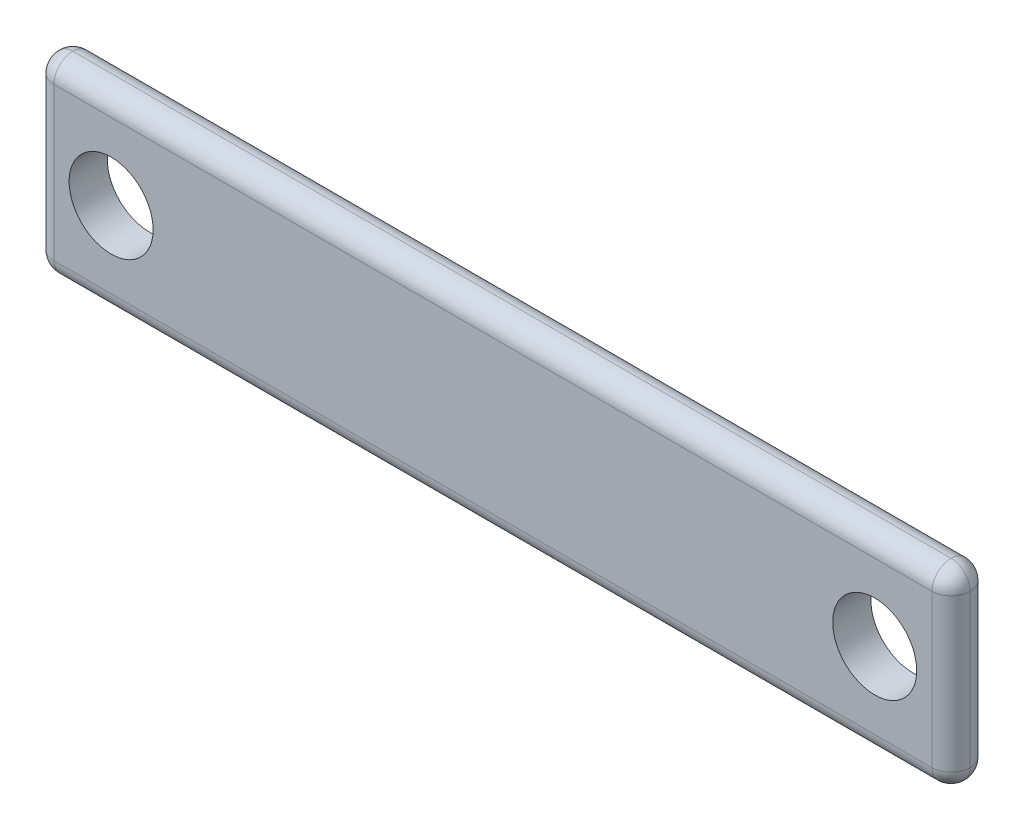
ISO-10303-21;
HEADER;
FILE_DESCRIPTION(('STEP AP214'),'2;1');
FILE_NAME('part.step','',(''),(''),'','','');
FILE_SCHEMA(('AUTOMOTIVE_DESIGN { 1 0 10303 214 1 1 1 1 }'));
ENDSEC;
DATA;
#1=APPLICATION_CONTEXT('core data for automotive mechanical design processes');
#2=APPLICATION_PROTOCOL_DEFINITION('international standard','automotive_design',2000,#1);
#3=PRODUCT_CONTEXT('',#1,'mechanical');
#4=PRODUCT('Part','Part','',(#3));
#5=PRODUCT_RELATED_PRODUCT_CATEGORY('part','',(#4));
#6=PRODUCT_DEFINITION_FORMATION('','',#4);
#7=PRODUCT_DEFINITION_CONTEXT('part definition',#1,'design');
#8=PRODUCT_DEFINITION('design','',#6,#7);
#9=PRODUCT_DEFINITION_SHAPE('','',#8);
#10=(LENGTH_UNIT() NAMED_UNIT(*) SI_UNIT(.MILLI.,.METRE.));
#11=(NAMED_UNIT(*) PLANE_ANGLE_UNIT() SI_UNIT($,.RADIAN.));
#12=(NAMED_UNIT(*) SI_UNIT($,.STERADIAN.) SOLID_ANGLE_UNIT());
#13=UNCERTAINTY_MEASURE_WITH_UNIT(LENGTH_MEASURE(1.E-05),#10,'distance_accuracy_value','');
#14=(GEOMETRIC_REPRESENTATION_CONTEXT(3) GLOBAL_UNCERTAINTY_ASSIGNED_CONTEXT((#13)) GLOBAL_UNIT_ASSIGNED_CONTEXT((#10,
#11,#12)) REPRESENTATION_CONTEXT('',''));
#15=CARTESIAN_POINT('',(0.,0.,0.));
#16=DIRECTION('',(0.,0.,1.));
#17=DIRECTION('',(1.,0.,0.));
#18=AXIS2_PLACEMENT_3D('',#15,#16,#17);
#19=CARTESIAN_POINT('',(0.,0.,10.));
#20=DIRECTION('',(0.,0.,-1.));
#21=DIRECTION('',(-1.,0.,0.));
#22=AXIS2_PLACEMENT_3D('',#19,#20,#21);
#23=PLANE('',#22);
#24=DIRECTION('',(0.,-1.,0.));
#25=VECTOR('',#24,1.);
#26=CARTESIAN_POINT('',(5.,0.,10.));
#27=LINE('',#26,#25);
#28=CARTESIAN_POINT('',(5.,45.,10.));
#29=VERTEX_POINT('',#28);
#30=CARTESIAN_POINT('',(5.,5.,10.));
#31=VERTEX_POINT('',#30);
#32=EDGE_CURVE('E117',#29,#31,#27,.T.);
#33=ORIENTED_EDGE('',*,*,#32,.T.);
#34=DIRECTION('',(1.,0.,0.));
#35=VECTOR('',#34,1.);
#36=CARTESIAN_POINT('',(0.,5.,10.));
#37=LINE('',#36,#35);
#38=CARTESIAN_POINT('',(235.,5.,10.));
#39=VERTEX_POINT('',#38);
#40=EDGE_CURVE('E11',#31,#39,#37,.T.);
#41=ORIENTED_EDGE('',*,*,#40,.T.);
#42=DIRECTION('',(0.,1.,0.));
#43=VECTOR('',#42,1.);
#44=CARTESIAN_POINT('',(235.,0.,10.));
#45=LINE('',#44,#43);
#46=CARTESIAN_POINT('',(235.,45.,10.));
#47=VERTEX_POINT('',#46);
#48=EDGE_CURVE('E50',#39,#47,#45,.T.);
#49=ORIENTED_EDGE('',*,*,#48,.T.);
#50=DIRECTION('',(-1.,0.,0.));
#51=VECTOR('',#50,1.);
#52=CARTESIAN_POINT('',(0.,45.,10.));
#53=LINE('',#52,#51);
#54=EDGE_CURVE('E115',#47,#29,#53,.T.);
#55=ORIENTED_EDGE('',*,*,#54,.T.);
#56=EDGE_LOOP('',(#33,#41,#49,#55));
#57=FACE_BOUND('',#56,.T.);
#58=CARTESIAN_POINT('',(20.,25.,10.));
#59=DIRECTION('',(0.,0.,1.));
#60=DIRECTION('',(1.,0.,0.));
#61=AXIS2_PLACEMENT_3D('',#58,#59,#60);
#62=CIRCLE('',#61,11.);
#63=CARTESIAN_POINT('',(31.,25.,10.));
#64=VERTEX_POINT('',#63);
#65=EDGE_CURVE('E185',#64,#64,#62,.T.);
#66=ORIENTED_EDGE('',*,*,#65,.F.);
#67=EDGE_LOOP('',(#66));
#68=FACE_BOUND('',#67,.T.);
#69=CARTESIAN_POINT('',(220.,25.,10.));
#70=DIRECTION('',(0.,0.,1.));
#71=DIRECTION('',(1.,0.,0.));
#72=AXIS2_PLACEMENT_3D('',#69,#70,#71);
#73=CIRCLE('',#72,11.);
#74=CARTESIAN_POINT('',(231.,25.,10.));
#75=VERTEX_POINT('',#74);
#76=EDGE_CURVE('E176',#75,#75,#73,.T.);
#77=ORIENTED_EDGE('',*,*,#76,.F.);
#78=EDGE_LOOP('',(#77));
#79=FACE_BOUND('',#78,.T.);
#80=ADVANCED_FACE('F39',(#57,#68,#79),#23,.F.);
#81=CARTESIAN_POINT('',(0.,0.,0.));
#82=DIRECTION('',(0.,0.,-1.));
#83=DIRECTION('',(-1.,0.,0.));
#84=AXIS2_PLACEMENT_3D('',#81,#82,#83);
#85=PLANE('',#84);
#86=DIRECTION('',(0.,1.,0.));
#87=VECTOR('',#86,1.);
#88=CARTESIAN_POINT('',(235.,0.,0.));
#89=LINE('',#88,#87);
#90=CARTESIAN_POINT('',(235.,45.,0.));
#91=VERTEX_POINT('',#90);
#92=CARTESIAN_POINT('',(235.,5.,0.));
#93=VERTEX_POINT('',#92);
#94=EDGE_CURVE('E197',#91,#93,#89,.F.);
#95=ORIENTED_EDGE('',*,*,#94,.T.);
#96=DIRECTION('',(1.,0.,0.));
#97=VECTOR('',#96,1.);
#98=CARTESIAN_POINT('',(0.,5.,0.));
#99=LINE('',#98,#97);
#100=CARTESIAN_POINT('',(5.,5.,0.));
#101=VERTEX_POINT('',#100);
#102=EDGE_CURVE('E123',#93,#101,#99,.F.);
#103=ORIENTED_EDGE('',*,*,#102,.T.);
#104=DIRECTION('',(0.,-1.,0.));
#105=VECTOR('',#104,1.);
#106=CARTESIAN_POINT('',(5.,50.,0.));
#107=LINE('',#106,#105);
#108=CARTESIAN_POINT('',(5.,45.,0.));
#109=VERTEX_POINT('',#108);
#110=EDGE_CURVE('E102',#101,#109,#107,.F.);
#111=ORIENTED_EDGE('',*,*,#110,.T.);
#112=DIRECTION('',(-1.,0.,0.));
#113=VECTOR('',#112,1.);
#114=CARTESIAN_POINT('',(240.,45.,0.));
#115=LINE('',#114,#113);
#116=EDGE_CURVE('E189',#109,#91,#115,.F.);
#117=ORIENTED_EDGE('',*,*,#116,.T.);
#118=EDGE_LOOP('',(#95,#103,#111,#117));
#119=FACE_BOUND('',#118,.T.);
#120=CARTESIAN_POINT('',(20.,25.,0.));
#121=DIRECTION('',(0.,0.,1.));
#122=DIRECTION('',(1.,0.,0.));
#123=AXIS2_PLACEMENT_3D('',#120,#121,#122);
#124=CIRCLE('',#123,11.);
#125=CARTESIAN_POINT('',(31.,25.,0.));
#126=VERTEX_POINT('',#125);
#127=EDGE_CURVE('E182',#126,#126,#124,.T.);
#128=ORIENTED_EDGE('',*,*,#127,.T.);
#129=EDGE_LOOP('',(#128));
#130=FACE_BOUND('',#129,.T.);
#131=CARTESIAN_POINT('',(220.,25.,0.));
#132=DIRECTION('',(0.,0.,1.));
#133=DIRECTION('',(1.,0.,0.));
#134=AXIS2_PLACEMENT_3D('',#131,#132,#133);
#135=CIRCLE('',#134,11.);
#136=CARTESIAN_POINT('',(231.,25.,0.));
#137=VERTEX_POINT('',#136);
#138=EDGE_CURVE('E173',#137,#137,#135,.T.);
#139=ORIENTED_EDGE('',*,*,#138,.T.);
#140=EDGE_LOOP('',(#139));
#141=FACE_BOUND('',#140,.T.);
#142=ADVANCED_FACE('F272',(#119,#130,#141),#85,.T.);
#143=CARTESIAN_POINT('',(20.,25.,10.));
#144=DIRECTION('',(0.,0.,-1.));
#145=DIRECTION('',(-1.,0.,0.));
#146=AXIS2_PLACEMENT_3D('',#143,#144,#145);
#147=CYLINDRICAL_SURFACE('',#146,11.);
#148=ORIENTED_EDGE('',*,*,#65,.T.);
#149=EDGE_LOOP('',(#148));
#150=FACE_BOUND('',#149,.T.);
#151=ORIENTED_EDGE('',*,*,#127,.F.);
#152=EDGE_LOOP('',(#151));
#153=FACE_BOUND('',#152,.T.);
#154=ADVANCED_FACE('F277',(#150,#153),#147,.F.);
#155=CARTESIAN_POINT('',(220.,25.,10.));
#156=DIRECTION('',(0.,0.,-1.));
#157=DIRECTION('',(-1.,0.,0.));
#158=AXIS2_PLACEMENT_3D('',#155,#156,#157);
#159=CYLINDRICAL_SURFACE('',#158,11.);
#160=ORIENTED_EDGE('',*,*,#76,.T.);
#161=EDGE_LOOP('',(#160));
#162=FACE_BOUND('',#161,.T.);
#163=ORIENTED_EDGE('',*,*,#138,.F.);
#164=EDGE_LOOP('',(#163));
#165=FACE_BOUND('',#164,.T.);
#166=ADVANCED_FACE('F409',(#162,#165),#159,.F.);
#167=CARTESIAN_POINT('',(5.,0.,5.));
#168=DIRECTION('',(0.,-1.,0.));
#169=DIRECTION('',(0.,0.,-1.));
#170=AXIS2_PLACEMENT_3D('',#167,#168,#169);
#171=CYLINDRICAL_SURFACE('',#170,5.);
#172=DIRECTION('',(0.,-1.,0.));
#173=VECTOR('',#172,1.);
#174=CARTESIAN_POINT('',(0.,0.,5.));
#175=LINE('',#174,#173);
#176=CARTESIAN_POINT('',(0.,5.,5.));
#177=VERTEX_POINT('',#176);
#178=CARTESIAN_POINT('',(0.,45.,5.));
#179=VERTEX_POINT('',#178);
#180=EDGE_CURVE('E159',#177,#179,#175,.F.);
#181=ORIENTED_EDGE('',*,*,#180,.F.);
#182=CARTESIAN_POINT('',(5.,5.,5.));
#183=DIRECTION('',(0.,-1.,0.));
#184=DIRECTION('',(0.,0.,-1.));
#185=AXIS2_PLACEMENT_3D('',#182,#183,#184);
#186=CIRCLE('',#185,5.);
#187=EDGE_CURVE('E43',#31,#177,#186,.T.);
#188=ORIENTED_EDGE('',*,*,#187,.F.);
#189=ORIENTED_EDGE('',*,*,#32,.F.);
#190=CARTESIAN_POINT('',(5.,45.,5.));
#191=DIRECTION('',(0.,1.,0.));
#192=DIRECTION('',(0.,0.,1.));
#193=AXIS2_PLACEMENT_3D('',#190,#191,#192);
#194=CIRCLE('',#193,5.);
#195=EDGE_CURVE('E86',#179,#29,#194,.T.);
#196=ORIENTED_EDGE('',*,*,#195,.F.);
#197=EDGE_LOOP('',(#181,#188,#189,#196));
#198=FACE_BOUND('',#197,.T.);
#199=ADVANCED_FACE('F41',(#198),#171,.T.);
#200=CARTESIAN_POINT('',(5.,5.,5.));
#201=DIRECTION('',(-1.,0.,0.));
#202=DIRECTION('',(0.,0.,1.));
#203=AXIS2_PLACEMENT_3D('',#200,#201,#202);
#204=SPHERICAL_SURFACE('',#203,5.);
#205=ORIENTED_EDGE('',*,*,#187,.T.);
#206=CARTESIAN_POINT('',(5.,5.,5.));
#207=DIRECTION('',(0.,0.,-1.));
#208=DIRECTION('',(-1.,0.,0.));
#209=AXIS2_PLACEMENT_3D('',#206,#207,#208);
#210=CIRCLE('',#209,5.);
#211=CARTESIAN_POINT('',(5.,0.,5.));
#212=VERTEX_POINT('',#211);
#213=EDGE_CURVE('E93',#212,#177,#210,.T.);
#214=ORIENTED_EDGE('',*,*,#213,.F.);
#215=CARTESIAN_POINT('',(5.,5.,5.));
#216=DIRECTION('',(-1.,0.,0.));
#217=DIRECTION('',(0.,0.,1.));
#218=AXIS2_PLACEMENT_3D('',#215,#216,#217);
#219=CIRCLE('',#218,5.);
#220=EDGE_CURVE('E142',#31,#212,#219,.F.);
#221=ORIENTED_EDGE('',*,*,#220,.F.);
#222=EDGE_LOOP('',(#205,#214,#221));
#223=FACE_BOUND('',#222,.T.);
#224=ADVANCED_FACE('F171',(#223),#204,.T.);
#225=CARTESIAN_POINT('',(5.,45.,5.));
#226=DIRECTION('',(-1.,0.,0.));
#227=DIRECTION('',(0.,0.,1.));
#228=AXIS2_PLACEMENT_3D('',#225,#226,#227);
#229=SPHERICAL_SURFACE('',#228,5.);
#230=CARTESIAN_POINT('',(5.,45.,5.));
#231=DIRECTION('',(0.,0.,1.));
#232=DIRECTION('',(1.,0.,0.));
#233=AXIS2_PLACEMENT_3D('',#230,#231,#232);
#234=CIRCLE('',#233,5.);
#235=CARTESIAN_POINT('',(5.,50.,5.));
#236=VERTEX_POINT('',#235);
#237=EDGE_CURVE('E133',#179,#236,#234,.F.);
#238=ORIENTED_EDGE('',*,*,#237,.F.);
#239=ORIENTED_EDGE('',*,*,#195,.T.);
#240=CARTESIAN_POINT('',(5.,45.,5.));
#241=DIRECTION('',(-1.,0.,0.));
#242=DIRECTION('',(0.,0.,1.));
#243=AXIS2_PLACEMENT_3D('',#240,#241,#242);
#244=CIRCLE('',#243,5.);
#245=EDGE_CURVE('E131',#236,#29,#244,.F.);
#246=ORIENTED_EDGE('',*,*,#245,.F.);
#247=EDGE_LOOP('',(#238,#239,#246));
#248=FACE_BOUND('',#247,.T.);
#249=ADVANCED_FACE('F130',(#248),#229,.T.);
#250=CARTESIAN_POINT('',(5.,0.,5.));
#251=DIRECTION('',(0.,1.,0.));
#252=DIRECTION('',(0.,0.,1.));
#253=AXIS2_PLACEMENT_3D('',#250,#251,#252);
#254=CYLINDRICAL_SURFACE('',#253,5.);
#255=CARTESIAN_POINT('',(5.,5.,5.));
#256=DIRECTION('',(0.,-1.,0.));
#257=DIRECTION('',(0.,0.,-1.));
#258=AXIS2_PLACEMENT_3D('',#255,#256,#257);
#259=CIRCLE('',#258,5.);
#260=EDGE_CURVE('E156',#177,#101,#259,.T.);
#261=ORIENTED_EDGE('',*,*,#260,.F.);
#262=ORIENTED_EDGE('',*,*,#180,.T.);
#263=CARTESIAN_POINT('',(5.,45.,5.));
#264=DIRECTION('',(0.,1.,0.));
#265=DIRECTION('',(0.,0.,1.));
#266=AXIS2_PLACEMENT_3D('',#263,#264,#265);
#267=CIRCLE('',#266,5.);
#268=EDGE_CURVE('E143',#109,#179,#267,.T.);
#269=ORIENTED_EDGE('',*,*,#268,.F.);
#270=ORIENTED_EDGE('',*,*,#110,.F.);
#271=EDGE_LOOP('',(#261,#262,#269,#270));
#272=FACE_BOUND('',#271,.T.);
#273=ADVANCED_FACE('F169',(#272),#254,.T.);
#274=CARTESIAN_POINT('',(5.,5.,5.));
#275=DIRECTION('',(-1.,0.,0.));
#276=DIRECTION('',(0.,0.,1.));
#277=AXIS2_PLACEMENT_3D('',#274,#275,#276);
#278=SPHERICAL_SURFACE('',#277,5.);
#279=ORIENTED_EDGE('',*,*,#213,.T.);
#280=ORIENTED_EDGE('',*,*,#260,.T.);
#281=CARTESIAN_POINT('',(5.,5.,5.));
#282=DIRECTION('',(-1.,0.,0.));
#283=DIRECTION('',(0.,-1.,0.));
#284=AXIS2_PLACEMENT_3D('',#281,#282,#283);
#285=CIRCLE('',#284,5.);
#286=EDGE_CURVE('E150',#212,#101,#285,.F.);
#287=ORIENTED_EDGE('',*,*,#286,.F.);
#288=EDGE_LOOP('',(#279,#280,#287));
#289=FACE_BOUND('',#288,.T.);
#290=ADVANCED_FACE('F260',(#289),#278,.T.);
#291=CARTESIAN_POINT('',(0.,5.,5.));
#292=DIRECTION('',(1.,0.,0.));
#293=DIRECTION('',(0.,1.,0.));
#294=AXIS2_PLACEMENT_3D('',#291,#292,#293);
#295=CYLINDRICAL_SURFACE('',#294,5.);
#296=ORIENTED_EDGE('',*,*,#40,.F.);
#297=ORIENTED_EDGE('',*,*,#220,.T.);
#298=DIRECTION('',(1.,0.,0.));
#299=VECTOR('',#298,1.);
#300=CARTESIAN_POINT('',(240.,0.,5.));
#301=LINE('',#300,#299);
#302=CARTESIAN_POINT('',(235.,0.,5.));
#303=VERTEX_POINT('',#302);
#304=EDGE_CURVE('E251',#303,#212,#301,.F.);
#305=ORIENTED_EDGE('',*,*,#304,.F.);
#306=CARTESIAN_POINT('',(235.,5.,5.));
#307=DIRECTION('',(1.,0.,0.));
#308=DIRECTION('',(0.,0.,-1.));
#309=AXIS2_PLACEMENT_3D('',#306,#307,#308);
#310=CIRCLE('',#309,5.);
#311=EDGE_CURVE('E247',#39,#303,#310,.T.);
#312=ORIENTED_EDGE('',*,*,#311,.F.);
#313=EDGE_LOOP('',(#296,#297,#305,#312));
#314=FACE_BOUND('',#313,.T.);
#315=ADVANCED_FACE('F262',(#314),#295,.T.);
#316=CARTESIAN_POINT('',(0.,45.,5.));
#317=DIRECTION('',(-1.,0.,0.));
#318=DIRECTION('',(0.,0.,1.));
#319=AXIS2_PLACEMENT_3D('',#316,#317,#318);
#320=CYLINDRICAL_SURFACE('',#319,5.);
#321=ORIENTED_EDGE('',*,*,#245,.T.);
#322=ORIENTED_EDGE('',*,*,#54,.F.);
#323=CARTESIAN_POINT('',(235.,45.,5.));
#324=DIRECTION('',(1.,0.,0.));
#325=DIRECTION('',(0.,0.,-1.));
#326=AXIS2_PLACEMENT_3D('',#323,#324,#325);
#327=CIRCLE('',#326,5.);
#328=CARTESIAN_POINT('',(235.,50.,5.));
#329=VERTEX_POINT('',#328);
#330=EDGE_CURVE('E243',#329,#47,#327,.T.);
#331=ORIENTED_EDGE('',*,*,#330,.F.);
#332=DIRECTION('',(-1.,0.,0.));
#333=VECTOR('',#332,1.);
#334=CARTESIAN_POINT('',(0.,50.,5.));
#335=LINE('',#334,#333);
#336=EDGE_CURVE('E139',#236,#329,#335,.F.);
#337=ORIENTED_EDGE('',*,*,#336,.F.);
#338=EDGE_LOOP('',(#321,#322,#331,#337));
#339=FACE_BOUND('',#338,.T.);
#340=ADVANCED_FACE('F137',(#339),#320,.T.);
#341=CARTESIAN_POINT('',(5.,45.,5.));
#342=DIRECTION('',(-1.,0.,0.));
#343=DIRECTION('',(0.,0.,1.));
#344=AXIS2_PLACEMENT_3D('',#341,#342,#343);
#345=SPHERICAL_SURFACE('',#344,5.);
#346=ORIENTED_EDGE('',*,*,#268,.T.);
#347=ORIENTED_EDGE('',*,*,#237,.T.);
#348=CARTESIAN_POINT('',(5.,45.,5.));
#349=DIRECTION('',(-1.,0.,0.));
#350=DIRECTION('',(0.,0.,1.));
#351=AXIS2_PLACEMENT_3D('',#348,#349,#350);
#352=CIRCLE('',#351,5.);
#353=EDGE_CURVE('E166',#109,#236,#352,.F.);
#354=ORIENTED_EDGE('',*,*,#353,.F.);
#355=EDGE_LOOP('',(#346,#347,#354));
#356=FACE_BOUND('',#355,.T.);
#357=ADVANCED_FACE('F165',(#356),#345,.T.);
#358=CARTESIAN_POINT('',(240.,5.,5.));
#359=DIRECTION('',(-1.,0.,0.));
#360=DIRECTION('',(0.,-1.,0.));
#361=AXIS2_PLACEMENT_3D('',#358,#359,#360);
#362=CYLINDRICAL_SURFACE('',#361,5.);
#363=CARTESIAN_POINT('',(235.,5.,5.));
#364=DIRECTION('',(1.,0.,0.));
#365=DIRECTION('',(0.,0.,-1.));
#366=AXIS2_PLACEMENT_3D('',#363,#364,#365);
#367=CIRCLE('',#366,5.);
#368=EDGE_CURVE('E231',#303,#93,#367,.T.);
#369=ORIENTED_EDGE('',*,*,#368,.F.);
#370=ORIENTED_EDGE('',*,*,#304,.T.);
#371=ORIENTED_EDGE('',*,*,#286,.T.);
#372=ORIENTED_EDGE('',*,*,#102,.F.);
#373=EDGE_LOOP('',(#369,#370,#371,#372));
#374=FACE_BOUND('',#373,.T.);
#375=ADVANCED_FACE('F259',(#374),#362,.T.);
#376=CARTESIAN_POINT('',(235.,5.,5.));
#377=DIRECTION('',(0.,-1.,0.));
#378=DIRECTION('',(0.,0.,-1.));
#379=AXIS2_PLACEMENT_3D('',#376,#377,#378);
#380=SPHERICAL_SURFACE('',#379,5.);
#381=ORIENTED_EDGE('',*,*,#311,.T.);
#382=CARTESIAN_POINT('',(235.,5.,5.));
#383=DIRECTION('',(0.,0.,-1.));
#384=DIRECTION('',(-1.,0.,0.));
#385=AXIS2_PLACEMENT_3D('',#382,#383,#384);
#386=CIRCLE('',#385,5.);
#387=CARTESIAN_POINT('',(240.,5.,5.));
#388=VERTEX_POINT('',#387);
#389=EDGE_CURVE('E227',#388,#303,#386,.T.);
#390=ORIENTED_EDGE('',*,*,#389,.F.);
#391=CARTESIAN_POINT('',(235.,5.,5.));
#392=DIRECTION('',(0.,-1.,0.));
#393=DIRECTION('',(0.,0.,-1.));
#394=AXIS2_PLACEMENT_3D('',#391,#392,#393);
#395=CIRCLE('',#394,5.);
#396=EDGE_CURVE('E223',#39,#388,#395,.F.);
#397=ORIENTED_EDGE('',*,*,#396,.F.);
#398=EDGE_LOOP('',(#381,#390,#397));
#399=FACE_BOUND('',#398,.T.);
#400=ADVANCED_FACE('F305',(#399),#380,.T.);
#401=CARTESIAN_POINT('',(235.,45.,5.));
#402=DIRECTION('',(0.,1.,0.));
#403=DIRECTION('',(0.,0.,1.));
#404=AXIS2_PLACEMENT_3D('',#401,#402,#403);
#405=SPHERICAL_SURFACE('',#404,5.);
#406=CARTESIAN_POINT('',(235.,45.,5.));
#407=DIRECTION('',(0.,0.,1.));
#408=DIRECTION('',(1.,0.,0.));
#409=AXIS2_PLACEMENT_3D('',#406,#407,#408);
#410=CIRCLE('',#409,5.);
#411=CARTESIAN_POINT('',(240.,45.,5.));
#412=VERTEX_POINT('',#411);
#413=EDGE_CURVE('E239',#329,#412,#410,.F.);
#414=ORIENTED_EDGE('',*,*,#413,.F.);
#415=ORIENTED_EDGE('',*,*,#330,.T.);
#416=CARTESIAN_POINT('',(235.,45.,5.));
#417=DIRECTION('',(0.,1.,0.));
#418=DIRECTION('',(0.,0.,1.));
#419=AXIS2_PLACEMENT_3D('',#416,#417,#418);
#420=CIRCLE('',#419,5.);
#421=EDGE_CURVE('E220',#412,#47,#420,.F.);
#422=ORIENTED_EDGE('',*,*,#421,.F.);
#423=EDGE_LOOP('',(#414,#415,#422));
#424=FACE_BOUND('',#423,.T.);
#425=ADVANCED_FACE('F301',(#424),#405,.T.);
#426=CARTESIAN_POINT('',(0.,45.,5.));
#427=DIRECTION('',(1.,0.,0.));
#428=DIRECTION('',(0.,0.,-1.));
#429=AXIS2_PLACEMENT_3D('',#426,#427,#428);
#430=CYLINDRICAL_SURFACE('',#429,5.);
#431=ORIENTED_EDGE('',*,*,#353,.T.);
#432=ORIENTED_EDGE('',*,*,#336,.T.);
#433=CARTESIAN_POINT('',(235.,45.,5.));
#434=DIRECTION('',(1.,0.,0.));
#435=DIRECTION('',(0.,0.,-1.));
#436=AXIS2_PLACEMENT_3D('',#433,#434,#435);
#437=CIRCLE('',#436,5.);
#438=EDGE_CURVE('E216',#91,#329,#437,.T.);
#439=ORIENTED_EDGE('',*,*,#438,.F.);
#440=ORIENTED_EDGE('',*,*,#116,.F.);
#441=EDGE_LOOP('',(#431,#432,#439,#440));
#442=FACE_BOUND('',#441,.T.);
#443=ADVANCED_FACE('F297',(#442),#430,.T.);
#444=CARTESIAN_POINT('',(235.,5.,5.));
#445=DIRECTION('',(0.,-1.,0.));
#446=DIRECTION('',(0.,0.,-1.));
#447=AXIS2_PLACEMENT_3D('',#444,#445,#446);
#448=SPHERICAL_SURFACE('',#447,5.);
#449=ORIENTED_EDGE('',*,*,#389,.T.);
#450=ORIENTED_EDGE('',*,*,#368,.T.);
#451=CARTESIAN_POINT('',(235.,5.,5.));
#452=DIRECTION('',(0.,-1.,0.));
#453=DIRECTION('',(1.,0.,0.));
#454=AXIS2_PLACEMENT_3D('',#451,#452,#453);
#455=CIRCLE('',#454,5.);
#456=EDGE_CURVE('E213',#388,#93,#455,.F.);
#457=ORIENTED_EDGE('',*,*,#456,.F.);
#458=EDGE_LOOP('',(#449,#450,#457));
#459=FACE_BOUND('',#458,.T.);
#460=ADVANCED_FACE('F293',(#459),#448,.T.);
#461=CARTESIAN_POINT('',(235.,0.,5.));
#462=DIRECTION('',(0.,1.,0.));
#463=DIRECTION('',(0.,0.,1.));
#464=AXIS2_PLACEMENT_3D('',#461,#462,#463);
#465=CYLINDRICAL_SURFACE('',#464,5.);
#466=ORIENTED_EDGE('',*,*,#48,.F.);
#467=ORIENTED_EDGE('',*,*,#396,.T.);
#468=DIRECTION('',(0.,1.,0.));
#469=VECTOR('',#468,1.);
#470=CARTESIAN_POINT('',(240.,50.,5.));
#471=LINE('',#470,#469);
#472=EDGE_CURVE('E209',#412,#388,#471,.F.);
#473=ORIENTED_EDGE('',*,*,#472,.F.);
#474=ORIENTED_EDGE('',*,*,#421,.T.);
#475=EDGE_LOOP('',(#466,#467,#473,#474));
#476=FACE_BOUND('',#475,.T.);
#477=ADVANCED_FACE('F289',(#476),#465,.T.);
#478=CARTESIAN_POINT('',(235.,45.,5.));
#479=DIRECTION('',(0.,1.,0.));
#480=DIRECTION('',(0.,0.,1.));
#481=AXIS2_PLACEMENT_3D('',#478,#479,#480);
#482=SPHERICAL_SURFACE('',#481,5.);
#483=ORIENTED_EDGE('',*,*,#438,.T.);
#484=ORIENTED_EDGE('',*,*,#413,.T.);
#485=CARTESIAN_POINT('',(235.,45.,5.));
#486=DIRECTION('',(0.,1.,0.));
#487=DIRECTION('',(0.,0.,1.));
#488=AXIS2_PLACEMENT_3D('',#485,#486,#487);
#489=CIRCLE('',#488,5.);
#490=EDGE_CURVE('E205',#91,#412,#489,.F.);
#491=ORIENTED_EDGE('',*,*,#490,.F.);
#492=EDGE_LOOP('',(#483,#484,#491));
#493=FACE_BOUND('',#492,.T.);
#494=ADVANCED_FACE('F285',(#493),#482,.T.);
#495=CARTESIAN_POINT('',(235.,50.,5.));
#496=DIRECTION('',(0.,-1.,0.));
#497=DIRECTION('',(0.,0.,-1.));
#498=AXIS2_PLACEMENT_3D('',#495,#496,#497);
#499=CYLINDRICAL_SURFACE('',#498,5.);
#500=ORIENTED_EDGE('',*,*,#456,.T.);
#501=ORIENTED_EDGE('',*,*,#94,.F.);
#502=ORIENTED_EDGE('',*,*,#490,.T.);
#503=ORIENTED_EDGE('',*,*,#472,.T.);
#504=EDGE_LOOP('',(#500,#501,#502,#503));
#505=FACE_BOUND('',#504,.T.);
#506=ADVANCED_FACE('F282',(#505),#499,.T.);
#507=CLOSED_SHELL('',(#80,#142,#154,#166,#199,#224,#249,#273,#290,#315,#340,#357,#375,#400,#425,
#443,#460,#477,#494,#506));
#508=MANIFOLD_SOLID_BREP('B2',#507);
#509=ADVANCED_BREP_SHAPE_REPRESENTATION('',(#18,#508),#14);
#510=SHAPE_DEFINITION_REPRESENTATION(#9,#509);
ENDSEC;
END-ISO-10303-21;
